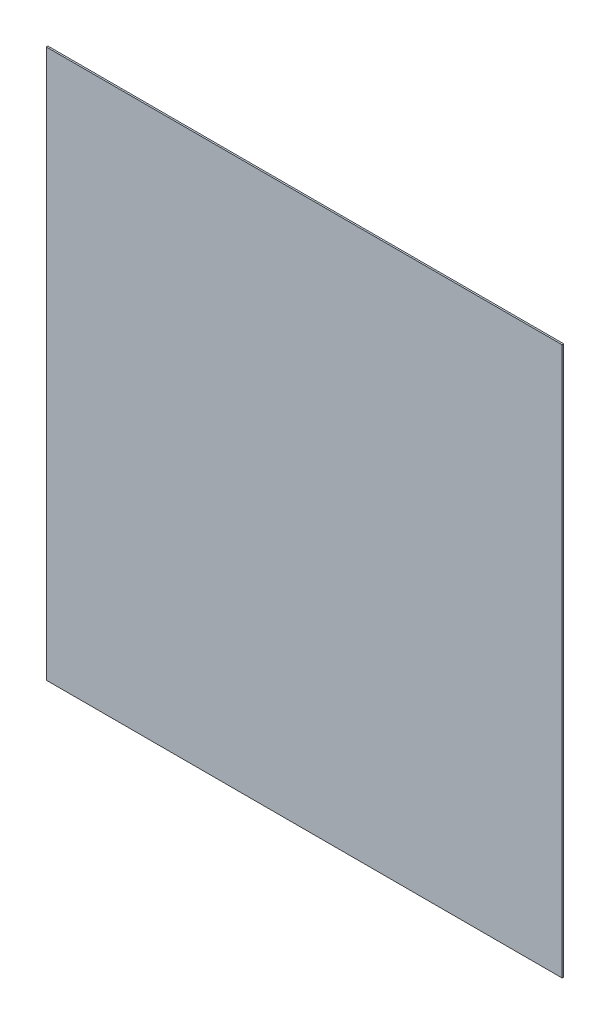
ISO-10303-21;
HEADER;
FILE_DESCRIPTION(('STEP AP214'),'2;1');
FILE_NAME('part.step','',(''),(''),'','','');
FILE_SCHEMA(('AUTOMOTIVE_DESIGN { 1 0 10303 214 1 1 1 1 }'));
ENDSEC;
DATA;
#1=APPLICATION_CONTEXT('core data for automotive mechanical design processes');
#2=APPLICATION_PROTOCOL_DEFINITION('international standard','automotive_design',2000,#1);
#3=PRODUCT_CONTEXT('',#1,'mechanical');
#4=PRODUCT('Part','Part','',(#3));
#5=PRODUCT_RELATED_PRODUCT_CATEGORY('part','',(#4));
#6=PRODUCT_DEFINITION_FORMATION('','',#4);
#7=PRODUCT_DEFINITION_CONTEXT('part definition',#1,'design');
#8=PRODUCT_DEFINITION('design','',#6,#7);
#9=PRODUCT_DEFINITION_SHAPE('','',#8);
#10=(LENGTH_UNIT() NAMED_UNIT(*) SI_UNIT(.MILLI.,.METRE.));
#11=(NAMED_UNIT(*) PLANE_ANGLE_UNIT() SI_UNIT($,.RADIAN.));
#12=(NAMED_UNIT(*) SI_UNIT($,.STERADIAN.) SOLID_ANGLE_UNIT());
#13=UNCERTAINTY_MEASURE_WITH_UNIT(LENGTH_MEASURE(1.E-05),#10,'distance_accuracy_value','');
#14=(GEOMETRIC_REPRESENTATION_CONTEXT(3) GLOBAL_UNCERTAINTY_ASSIGNED_CONTEXT((#13)) GLOBAL_UNIT_ASSIGNED_CONTEXT((#10,
#11,#12)) REPRESENTATION_CONTEXT('',''));
#15=CARTESIAN_POINT('',(0.,0.,0.));
#16=DIRECTION('',(0.,0.,1.));
#17=DIRECTION('',(1.,0.,0.));
#18=AXIS2_PLACEMENT_3D('',#15,#16,#17);
#19=CARTESIAN_POINT('',(0.,0.,5.));
#20=DIRECTION('',(0.,1.,0.));
#21=DIRECTION('',(0.,0.,1.));
#22=AXIS2_PLACEMENT_3D('',#19,#20,#21);
#23=PLANE('',#22);
#24=DIRECTION('',(1.,0.,0.));
#25=VECTOR('',#24,1.);
#26=CARTESIAN_POINT('',(0.,0.,0.));
#27=LINE('',#26,#25);
#28=CARTESIAN_POINT('',(0.,0.,0.));
#29=VERTEX_POINT('',#28);
#30=CARTESIAN_POINT('',(1580.,0.,0.));
#31=VERTEX_POINT('',#30);
#32=EDGE_CURVE('E96',#29,#31,#27,.T.);
#33=ORIENTED_EDGE('',*,*,#32,.T.);
#34=DIRECTION('',(0.,0.,-1.));
#35=VECTOR('',#34,1.);
#36=CARTESIAN_POINT('',(1580.,0.,5.));
#37=LINE('',#36,#35);
#38=CARTESIAN_POINT('',(1580.,0.,5.));
#39=VERTEX_POINT('',#38);
#40=EDGE_CURVE('E11',#39,#31,#37,.T.);
#41=ORIENTED_EDGE('',*,*,#40,.F.);
#42=DIRECTION('',(1.,0.,0.));
#43=VECTOR('',#42,1.);
#44=CARTESIAN_POINT('',(0.,0.,5.));
#45=LINE('',#44,#43);
#46=CARTESIAN_POINT('',(0.,0.,5.));
#47=VERTEX_POINT('',#46);
#48=EDGE_CURVE('E82',#47,#39,#45,.T.);
#49=ORIENTED_EDGE('',*,*,#48,.F.);
#50=DIRECTION('',(0.,0.,-1.));
#51=VECTOR('',#50,1.);
#52=CARTESIAN_POINT('',(0.,0.,5.));
#53=LINE('',#52,#51);
#54=EDGE_CURVE('E49',#47,#29,#53,.T.);
#55=ORIENTED_EDGE('',*,*,#54,.T.);
#56=EDGE_LOOP('',(#33,#41,#49,#55));
#57=FACE_BOUND('',#56,.T.);
#58=ADVANCED_FACE('F33',(#57),#23,.F.);
#59=CARTESIAN_POINT('',(1580.,0.,5.));
#60=DIRECTION('',(-1.,0.,0.));
#61=DIRECTION('',(0.,0.,1.));
#62=AXIS2_PLACEMENT_3D('',#59,#60,#61);
#63=PLANE('',#62);
#64=DIRECTION('',(0.,1.,0.));
#65=VECTOR('',#64,1.);
#66=CARTESIAN_POINT('',(1580.,0.,0.));
#67=LINE('',#66,#65);
#68=CARTESIAN_POINT('',(1580.,1680.,0.));
#69=VERTEX_POINT('',#68);
#70=EDGE_CURVE('E87',#31,#69,#67,.T.);
#71=ORIENTED_EDGE('',*,*,#70,.T.);
#72=DIRECTION('',(0.,0.,-1.));
#73=VECTOR('',#72,1.);
#74=CARTESIAN_POINT('',(1580.,1680.,5.));
#75=LINE('',#74,#73);
#76=CARTESIAN_POINT('',(1580.,1680.,5.));
#77=VERTEX_POINT('',#76);
#78=EDGE_CURVE('E41',#77,#69,#75,.T.);
#79=ORIENTED_EDGE('',*,*,#78,.F.);
#80=DIRECTION('',(0.,1.,0.));
#81=VECTOR('',#80,1.);
#82=CARTESIAN_POINT('',(1580.,0.,5.));
#83=LINE('',#82,#81);
#84=EDGE_CURVE('E74',#39,#77,#83,.T.);
#85=ORIENTED_EDGE('',*,*,#84,.F.);
#86=ORIENTED_EDGE('',*,*,#40,.T.);
#87=EDGE_LOOP('',(#71,#79,#85,#86));
#88=FACE_BOUND('',#87,.T.);
#89=ADVANCED_FACE('F86',(#88),#63,.F.);
#90=CARTESIAN_POINT('',(0.,1680.,5.));
#91=DIRECTION('',(0.,1.,0.));
#92=DIRECTION('',(0.,0.,1.));
#93=AXIS2_PLACEMENT_3D('',#90,#91,#92);
#94=PLANE('',#93);
#95=DIRECTION('',(1.,0.,0.));
#96=VECTOR('',#95,1.);
#97=CARTESIAN_POINT('',(0.,1680.,0.));
#98=LINE('',#97,#96);
#99=CARTESIAN_POINT('',(0.,1680.,0.));
#100=VERTEX_POINT('',#99);
#101=EDGE_CURVE('E99',#100,#69,#98,.T.);
#102=ORIENTED_EDGE('',*,*,#101,.F.);
#103=DIRECTION('',(0.,0.,-1.));
#104=VECTOR('',#103,1.);
#105=CARTESIAN_POINT('',(0.,1680.,5.));
#106=LINE('',#105,#104);
#107=CARTESIAN_POINT('',(0.,1680.,5.));
#108=VERTEX_POINT('',#107);
#109=EDGE_CURVE('E63',#108,#100,#106,.T.);
#110=ORIENTED_EDGE('',*,*,#109,.F.);
#111=DIRECTION('',(1.,0.,0.));
#112=VECTOR('',#111,1.);
#113=CARTESIAN_POINT('',(0.,1680.,5.));
#114=LINE('',#113,#112);
#115=EDGE_CURVE('E81',#108,#77,#114,.T.);
#116=ORIENTED_EDGE('',*,*,#115,.T.);
#117=ORIENTED_EDGE('',*,*,#78,.T.);
#118=EDGE_LOOP('',(#102,#110,#116,#117));
#119=FACE_BOUND('',#118,.T.);
#120=ADVANCED_FACE('F90',(#119),#94,.T.);
#121=CARTESIAN_POINT('',(0.,0.,5.));
#122=DIRECTION('',(-1.,0.,0.));
#123=DIRECTION('',(0.,0.,1.));
#124=AXIS2_PLACEMENT_3D('',#121,#122,#123);
#125=PLANE('',#124);
#126=DIRECTION('',(0.,1.,0.));
#127=VECTOR('',#126,1.);
#128=CARTESIAN_POINT('',(0.,0.,0.));
#129=LINE('',#128,#127);
#130=EDGE_CURVE('E101',#29,#100,#129,.T.);
#131=ORIENTED_EDGE('',*,*,#130,.F.);
#132=ORIENTED_EDGE('',*,*,#54,.F.);
#133=DIRECTION('',(0.,1.,0.));
#134=VECTOR('',#133,1.);
#135=CARTESIAN_POINT('',(0.,0.,5.));
#136=LINE('',#135,#134);
#137=EDGE_CURVE('E91',#47,#108,#136,.T.);
#138=ORIENTED_EDGE('',*,*,#137,.T.);
#139=ORIENTED_EDGE('',*,*,#109,.T.);
#140=EDGE_LOOP('',(#131,#132,#138,#139));
#141=FACE_BOUND('',#140,.T.);
#142=ADVANCED_FACE('F107',(#141),#125,.T.);
#143=CARTESIAN_POINT('',(0.,0.,5.));
#144=DIRECTION('',(0.,0.,1.));
#145=DIRECTION('',(1.,0.,0.));
#146=AXIS2_PLACEMENT_3D('',#143,#144,#145);
#147=PLANE('',#146);
#148=ORIENTED_EDGE('',*,*,#48,.T.);
#149=ORIENTED_EDGE('',*,*,#84,.T.);
#150=ORIENTED_EDGE('',*,*,#115,.F.);
#151=ORIENTED_EDGE('',*,*,#137,.F.);
#152=EDGE_LOOP('',(#148,#149,#150,#151));
#153=FACE_BOUND('',#152,.T.);
#154=ADVANCED_FACE('F78',(#153),#147,.T.);
#155=CARTESIAN_POINT('',(0.,0.,0.));
#156=DIRECTION('',(0.,0.,1.));
#157=DIRECTION('',(1.,0.,0.));
#158=AXIS2_PLACEMENT_3D('',#155,#156,#157);
#159=PLANE('',#158);
#160=ORIENTED_EDGE('',*,*,#32,.F.);
#161=ORIENTED_EDGE('',*,*,#130,.T.);
#162=ORIENTED_EDGE('',*,*,#101,.T.);
#163=ORIENTED_EDGE('',*,*,#70,.F.);
#164=EDGE_LOOP('',(#160,#161,#162,#163));
#165=FACE_BOUND('',#164,.T.);
#166=ADVANCED_FACE('F106',(#165),#159,.F.);
#167=CLOSED_SHELL('',(#58,#89,#120,#142,#154,#166));
#168=MANIFOLD_SOLID_BREP('B2',#167);
#169=ADVANCED_BREP_SHAPE_REPRESENTATION('',(#18,#168),#14);
#170=SHAPE_DEFINITION_REPRESENTATION(#9,#169);
ENDSEC;
END-ISO-10303-21;
